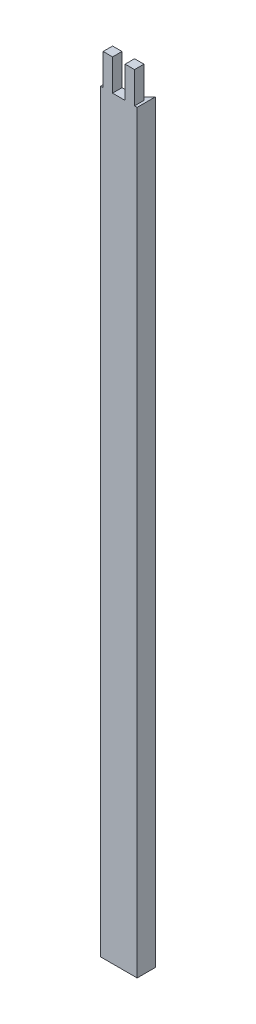
ISO-10303-21;
HEADER;
FILE_DESCRIPTION(('STEP AP214'),'2;1');
FILE_NAME('part.step','',(''),(''),'','','');
FILE_SCHEMA(('AUTOMOTIVE_DESIGN { 1 0 10303 214 1 1 1 1 }'));
ENDSEC;
DATA;
#1=APPLICATION_CONTEXT('core data for automotive mechanical design processes');
#2=APPLICATION_PROTOCOL_DEFINITION('international standard','automotive_design',2000,#1);
#3=PRODUCT_CONTEXT('',#1,'mechanical');
#4=PRODUCT('Part','Part','',(#3));
#5=PRODUCT_RELATED_PRODUCT_CATEGORY('part','',(#4));
#6=PRODUCT_DEFINITION_FORMATION('','',#4);
#7=PRODUCT_DEFINITION_CONTEXT('part definition',#1,'design');
#8=PRODUCT_DEFINITION('design','',#6,#7);
#9=PRODUCT_DEFINITION_SHAPE('','',#8);
#10=(LENGTH_UNIT() NAMED_UNIT(*) SI_UNIT(.MILLI.,.METRE.));
#11=(NAMED_UNIT(*) PLANE_ANGLE_UNIT() SI_UNIT($,.RADIAN.));
#12=(NAMED_UNIT(*) SI_UNIT($,.STERADIAN.) SOLID_ANGLE_UNIT());
#13=UNCERTAINTY_MEASURE_WITH_UNIT(LENGTH_MEASURE(1.E-05),#10,'distance_accuracy_value','');
#14=(GEOMETRIC_REPRESENTATION_CONTEXT(3) GLOBAL_UNCERTAINTY_ASSIGNED_CONTEXT((#13)) GLOBAL_UNIT_ASSIGNED_CONTEXT((#10,
#11,#12)) REPRESENTATION_CONTEXT('',''));
#15=CARTESIAN_POINT('',(0.,0.,0.));
#16=DIRECTION('',(0.,0.,1.));
#17=DIRECTION('',(1.,0.,0.));
#18=AXIS2_PLACEMENT_3D('',#15,#16,#17);
#19=CARTESIAN_POINT('',(0.,0.,3.));
#20=DIRECTION('',(0.,-1.,0.));
#21=DIRECTION('',(1.,0.,0.));
#22=AXIS2_PLACEMENT_3D('',#19,#20,#21);
#23=PLANE('',#22);
#24=DIRECTION('',(0.,0.,-1.));
#25=VECTOR('',#24,1.);
#26=CARTESIAN_POINT('',(2.00000000000002,0.,3.));
#27=LINE('',#26,#25);
#28=CARTESIAN_POINT('',(2.00000000000002,0.,3.));
#29=VERTEX_POINT('',#28);
#30=CARTESIAN_POINT('',(2.00000000000002,0.,0.));
#31=VERTEX_POINT('',#30);
#32=EDGE_CURVE('E169',#29,#31,#27,.T.);
#33=ORIENTED_EDGE('',*,*,#32,.F.);
#34=DIRECTION('',(-1.,0.,0.));
#35=VECTOR('',#34,1.);
#36=CARTESIAN_POINT('',(0.,0.,3.));
#37=LINE('',#36,#35);
#38=CARTESIAN_POINT('',(2.82842712474618,0.,3.));
#39=VERTEX_POINT('',#38);
#40=EDGE_CURVE('E261',#39,#29,#37,.T.);
#41=ORIENTED_EDGE('',*,*,#40,.F.);
#42=DIRECTION('',(0.,0.,1.));
#43=VECTOR('',#42,1.);
#44=CARTESIAN_POINT('',(2.82842712474619,0.,-2.82842712474619));
#45=LINE('',#44,#43);
#46=CARTESIAN_POINT('',(2.82842712474619,0.,-2.82842712474619));
#47=VERTEX_POINT('',#46);
#48=EDGE_CURVE('E242',#47,#39,#45,.T.);
#49=ORIENTED_EDGE('',*,*,#48,.F.);
#50=DIRECTION('',(0.707106781186546,0.,-0.707106781186549));
#51=VECTOR('',#50,1.);
#52=CARTESIAN_POINT('',(0.,0.,0.));
#53=LINE('',#52,#51);
#54=CARTESIAN_POINT('',(0.,0.,0.));
#55=VERTEX_POINT('',#54);
#56=EDGE_CURVE('E238',#55,#47,#53,.T.);
#57=ORIENTED_EDGE('',*,*,#56,.F.);
#58=DIRECTION('',(-1.,0.,0.));
#59=VECTOR('',#58,1.);
#60=CARTESIAN_POINT('',(2.00000000000002,0.,0.));
#61=LINE('',#60,#59);
#62=EDGE_CURVE('E57',#31,#55,#61,.T.);
#63=ORIENTED_EDGE('',*,*,#62,.F.);
#64=EDGE_LOOP('',(#33,#41,#49,#57,#63));
#65=FACE_BOUND('',#64,.T.);
#66=ADVANCED_FACE('F39',(#65),#23,.F.);
#67=DIRECTION('',(0.,0.,1.));
#68=VECTOR('',#67,1.);
#69=CARTESIAN_POINT('',(-0.999999999999984,0.,3.));
#70=LINE('',#69,#68);
#71=CARTESIAN_POINT('',(-0.999999999999984,0.,0.));
#72=VERTEX_POINT('',#71);
#73=CARTESIAN_POINT('',(-0.999999999999984,0.,3.));
#74=VERTEX_POINT('',#73);
#75=EDGE_CURVE('E166',#72,#74,#70,.T.);
#76=ORIENTED_EDGE('',*,*,#75,.F.);
#77=DIRECTION('',(-1.,0.,0.));
#78=VECTOR('',#77,1.);
#79=CARTESIAN_POINT('',(0.,0.,0.));
#80=LINE('',#79,#78);
#81=CARTESIAN_POINT('',(-4.99999999999998,0.,0.));
#82=VERTEX_POINT('',#81);
#83=EDGE_CURVE('E270',#72,#82,#80,.T.);
#84=ORIENTED_EDGE('',*,*,#83,.T.);
#85=DIRECTION('',(0.,0.,-1.));
#86=VECTOR('',#85,1.);
#87=CARTESIAN_POINT('',(-4.99999999999998,0.,3.));
#88=LINE('',#87,#86);
#89=CARTESIAN_POINT('',(-4.99999999999998,0.,3.));
#90=VERTEX_POINT('',#89);
#91=EDGE_CURVE('E176',#90,#82,#88,.T.);
#92=ORIENTED_EDGE('',*,*,#91,.F.);
#93=EDGE_CURVE('E65',#74,#90,#37,.T.);
#94=ORIENTED_EDGE('',*,*,#93,.F.);
#95=EDGE_LOOP('',(#76,#84,#92,#94));
#96=FACE_BOUND('',#95,.T.);
#97=ADVANCED_FACE('F291',(#96),#23,.F.);
#98=DIRECTION('',(0.,0.,1.));
#99=VECTOR('',#98,1.);
#100=CARTESIAN_POINT('',(-7.99999999999999,0.,3.));
#101=LINE('',#100,#99);
#102=CARTESIAN_POINT('',(-7.99999999999998,0.,0.));
#103=VERTEX_POINT('',#102);
#104=CARTESIAN_POINT('',(-7.99999999999999,0.,3.));
#105=VERTEX_POINT('',#104);
#106=EDGE_CURVE('E171',#103,#105,#101,.T.);
#107=ORIENTED_EDGE('',*,*,#106,.F.);
#108=DIRECTION('',(-1.,0.,0.));
#109=VECTOR('',#108,1.);
#110=CARTESIAN_POINT('',(-7.99999999999998,0.,0.));
#111=LINE('',#110,#109);
#112=CARTESIAN_POINT('',(-5.99999999999997,0.,0.));
#113=VERTEX_POINT('',#112);
#114=EDGE_CURVE('E11',#113,#103,#111,.T.);
#115=ORIENTED_EDGE('',*,*,#114,.F.);
#116=DIRECTION('',(0.707106781186546,0.,0.707106781186549));
#117=VECTOR('',#116,1.);
#118=CARTESIAN_POINT('',(-5.99999999999997,0.,0.));
#119=LINE('',#118,#117);
#120=CARTESIAN_POINT('',(-8.82842712474615,0.,-2.8284271247462));
#121=VERTEX_POINT('',#120);
#122=EDGE_CURVE('E219',#121,#113,#119,.T.);
#123=ORIENTED_EDGE('',*,*,#122,.F.);
#124=DIRECTION('',(0.,0.,-1.));
#125=VECTOR('',#124,1.);
#126=CARTESIAN_POINT('',(-8.82842712474615,0.,-2.8284271247462));
#127=LINE('',#126,#125);
#128=CARTESIAN_POINT('',(-8.82842712474615,0.,3.));
#129=VERTEX_POINT('',#128);
#130=EDGE_CURVE('E215',#129,#121,#127,.T.);
#131=ORIENTED_EDGE('',*,*,#130,.F.);
#132=EDGE_CURVE('E265',#105,#129,#37,.T.);
#133=ORIENTED_EDGE('',*,*,#132,.F.);
#134=EDGE_LOOP('',(#107,#115,#123,#131,#133));
#135=FACE_BOUND('',#134,.T.);
#136=ADVANCED_FACE('F41',(#135),#23,.F.);
#137=CARTESIAN_POINT('',(0.,-240.,3.));
#138=DIRECTION('',(0.,1.,0.));
#139=DIRECTION('',(0.,0.,1.));
#140=AXIS2_PLACEMENT_3D('',#137,#138,#139);
#141=PLANE('',#140);
#142=DIRECTION('',(1.,0.,0.));
#143=VECTOR('',#142,1.);
#144=CARTESIAN_POINT('',(0.,-240.,0.));
#145=LINE('',#144,#143);
#146=CARTESIAN_POINT('',(-5.99999999999997,-240.,0.));
#147=VERTEX_POINT('',#146);
#148=CARTESIAN_POINT('',(0.,-240.,0.));
#149=VERTEX_POINT('',#148);
#150=EDGE_CURVE('E43',#147,#149,#145,.T.);
#151=ORIENTED_EDGE('',*,*,#150,.T.);
#152=DIRECTION('',(0.707106781186546,0.,-0.707106781186549));
#153=VECTOR('',#152,1.);
#154=CARTESIAN_POINT('',(0.,-240.,0.));
#155=LINE('',#154,#153);
#156=CARTESIAN_POINT('',(2.82842712474619,-240.,-2.82842712474619));
#157=VERTEX_POINT('',#156);
#158=EDGE_CURVE('E235',#149,#157,#155,.T.);
#159=ORIENTED_EDGE('',*,*,#158,.T.);
#160=DIRECTION('',(0.,0.,1.));
#161=VECTOR('',#160,1.);
#162=CARTESIAN_POINT('',(2.82842712474619,-240.,-2.82842712474619));
#163=LINE('',#162,#161);
#164=CARTESIAN_POINT('',(2.82842712474618,-240.,3.));
#165=VERTEX_POINT('',#164);
#166=EDGE_CURVE('E243',#157,#165,#163,.T.);
#167=ORIENTED_EDGE('',*,*,#166,.T.);
#168=DIRECTION('',(1.,0.,0.));
#169=VECTOR('',#168,1.);
#170=CARTESIAN_POINT('',(0.,-240.,3.));
#171=LINE('',#170,#169);
#172=CARTESIAN_POINT('',(-8.82842712474615,-240.,3.));
#173=VERTEX_POINT('',#172);
#174=EDGE_CURVE('E49',#173,#165,#171,.T.);
#175=ORIENTED_EDGE('',*,*,#174,.F.);
#176=DIRECTION('',(0.,0.,-1.));
#177=VECTOR('',#176,1.);
#178=CARTESIAN_POINT('',(-8.82842712474615,-240.,-2.8284271247462));
#179=LINE('',#178,#177);
#180=CARTESIAN_POINT('',(-8.82842712474615,-240.,-2.8284271247462));
#181=VERTEX_POINT('',#180);
#182=EDGE_CURVE('E214',#173,#181,#179,.T.);
#183=ORIENTED_EDGE('',*,*,#182,.T.);
#184=DIRECTION('',(0.707106781186546,0.,0.707106781186549));
#185=VECTOR('',#184,1.);
#186=CARTESIAN_POINT('',(-5.99999999999997,-240.,0.));
#187=LINE('',#186,#185);
#188=EDGE_CURVE('E220',#181,#147,#187,.T.);
#189=ORIENTED_EDGE('',*,*,#188,.T.);
#190=EDGE_LOOP('',(#151,#159,#167,#175,#183,#189));
#191=FACE_BOUND('',#190,.T.);
#192=ADVANCED_FACE('F315',(#191),#141,.F.);
#193=CARTESIAN_POINT('',(0.,0.,3.));
#194=DIRECTION('',(0.,0.,-1.));
#195=DIRECTION('',(-1.,0.,0.));
#196=AXIS2_PLACEMENT_3D('',#193,#194,#195);
#197=PLANE('',#196);
#198=ORIENTED_EDGE('',*,*,#174,.T.);
#199=DIRECTION('',(0.,-1.,0.));
#200=VECTOR('',#199,1.);
#201=CARTESIAN_POINT('',(2.82842712474618,0.,3.));
#202=LINE('',#201,#200);
#203=EDGE_CURVE('E254',#39,#165,#202,.T.);
#204=ORIENTED_EDGE('',*,*,#203,.F.);
#205=ORIENTED_EDGE('',*,*,#40,.T.);
#206=DIRECTION('',(0.,-1.,0.));
#207=VECTOR('',#206,1.);
#208=CARTESIAN_POINT('',(2.00000000000002,10.,3.));
#209=LINE('',#208,#207);
#210=CARTESIAN_POINT('',(2.00000000000002,10.,3.));
#211=VERTEX_POINT('',#210);
#212=EDGE_CURVE('E318',#211,#29,#209,.T.);
#213=ORIENTED_EDGE('',*,*,#212,.F.);
#214=DIRECTION('',(1.,0.,0.));
#215=VECTOR('',#214,1.);
#216=CARTESIAN_POINT('',(2.00000000000002,10.,3.));
#217=LINE('',#216,#215);
#218=CARTESIAN_POINT('',(-0.999999999999986,10.,3.));
#219=VERTEX_POINT('',#218);
#220=EDGE_CURVE('E161',#219,#211,#217,.T.);
#221=ORIENTED_EDGE('',*,*,#220,.F.);
#222=DIRECTION('',(0.,-1.,0.));
#223=VECTOR('',#222,1.);
#224=CARTESIAN_POINT('',(-0.999999999999986,10.,3.));
#225=LINE('',#224,#223);
#226=EDGE_CURVE('E178',#219,#74,#225,.T.);
#227=ORIENTED_EDGE('',*,*,#226,.T.);
#228=ORIENTED_EDGE('',*,*,#93,.T.);
#229=DIRECTION('',(0.,-1.,0.));
#230=VECTOR('',#229,1.);
#231=CARTESIAN_POINT('',(-4.99999999999999,10.,3.));
#232=LINE('',#231,#230);
#233=CARTESIAN_POINT('',(-4.99999999999999,10.,3.));
#234=VERTEX_POINT('',#233);
#235=EDGE_CURVE('E206',#234,#90,#232,.T.);
#236=ORIENTED_EDGE('',*,*,#235,.F.);
#237=DIRECTION('',(1.,0.,0.));
#238=VECTOR('',#237,1.);
#239=CARTESIAN_POINT('',(-7.99999999999999,10.,3.));
#240=LINE('',#239,#238);
#241=CARTESIAN_POINT('',(-7.99999999999999,10.,3.));
#242=VERTEX_POINT('',#241);
#243=EDGE_CURVE('E186',#242,#234,#240,.T.);
#244=ORIENTED_EDGE('',*,*,#243,.F.);
#245=DIRECTION('',(0.,-1.,0.));
#246=VECTOR('',#245,1.);
#247=CARTESIAN_POINT('',(-7.99999999999999,10.,3.));
#248=LINE('',#247,#246);
#249=EDGE_CURVE('E210',#242,#105,#248,.T.);
#250=ORIENTED_EDGE('',*,*,#249,.T.);
#251=ORIENTED_EDGE('',*,*,#132,.T.);
#252=DIRECTION('',(0.,-1.,0.));
#253=VECTOR('',#252,1.);
#254=CARTESIAN_POINT('',(-8.82842712474615,0.,3.));
#255=LINE('',#254,#253);
#256=EDGE_CURVE('E231',#129,#173,#255,.T.);
#257=ORIENTED_EDGE('',*,*,#256,.T.);
#258=EDGE_LOOP('',(#198,#204,#205,#213,#221,#227,#228,#236,#244,#250,#251,#257));
#259=FACE_BOUND('',#258,.T.);
#260=ADVANCED_FACE('F288',(#259),#197,.F.);
#261=CARTESIAN_POINT('',(0.,0.,0.));
#262=DIRECTION('',(0.,0.,-1.));
#263=DIRECTION('',(-1.,0.,0.));
#264=AXIS2_PLACEMENT_3D('',#261,#262,#263);
#265=PLANE('',#264);
#266=DIRECTION('',(0.,1.,0.));
#267=VECTOR('',#266,1.);
#268=CARTESIAN_POINT('',(0.,0.,0.));
#269=LINE('',#268,#267);
#270=EDGE_CURVE('E258',#149,#55,#269,.T.);
#271=ORIENTED_EDGE('',*,*,#270,.F.);
#272=ORIENTED_EDGE('',*,*,#150,.F.);
#273=DIRECTION('',(0.,-1.,0.));
#274=VECTOR('',#273,1.);
#275=CARTESIAN_POINT('',(-6.,0.,0.));
#276=LINE('',#275,#274);
#277=EDGE_CURVE('E272',#113,#147,#276,.T.);
#278=ORIENTED_EDGE('',*,*,#277,.F.);
#279=ORIENTED_EDGE('',*,*,#114,.T.);
#280=DIRECTION('',(0.,-1.,0.));
#281=VECTOR('',#280,1.);
#282=CARTESIAN_POINT('',(-7.99999999999999,10.,0.));
#283=LINE('',#282,#281);
#284=CARTESIAN_POINT('',(-7.99999999999999,10.,0.));
#285=VERTEX_POINT('',#284);
#286=EDGE_CURVE('E194',#285,#103,#283,.T.);
#287=ORIENTED_EDGE('',*,*,#286,.F.);
#288=DIRECTION('',(-1.,0.,0.));
#289=VECTOR('',#288,1.);
#290=CARTESIAN_POINT('',(-7.99999999999999,10.,0.));
#291=LINE('',#290,#289);
#292=CARTESIAN_POINT('',(-4.99999999999999,10.,0.));
#293=VERTEX_POINT('',#292);
#294=EDGE_CURVE('E192',#293,#285,#291,.T.);
#295=ORIENTED_EDGE('',*,*,#294,.F.);
#296=DIRECTION('',(0.,-1.,0.));
#297=VECTOR('',#296,1.);
#298=CARTESIAN_POINT('',(-4.99999999999999,10.,0.));
#299=LINE('',#298,#297);
#300=EDGE_CURVE('E202',#293,#82,#299,.T.);
#301=ORIENTED_EDGE('',*,*,#300,.T.);
#302=ORIENTED_EDGE('',*,*,#83,.F.);
#303=DIRECTION('',(0.,-1.,0.));
#304=VECTOR('',#303,1.);
#305=CARTESIAN_POINT('',(-0.999999999999986,10.,0.));
#306=LINE('',#305,#304);
#307=CARTESIAN_POINT('',(-0.999999999999986,10.,0.));
#308=VERTEX_POINT('',#307);
#309=EDGE_CURVE('E151',#308,#72,#306,.T.);
#310=ORIENTED_EDGE('',*,*,#309,.F.);
#311=DIRECTION('',(-1.,0.,0.));
#312=VECTOR('',#311,1.);
#313=CARTESIAN_POINT('',(2.00000000000001,10.,0.));
#314=LINE('',#313,#312);
#315=CARTESIAN_POINT('',(2.00000000000001,10.,0.));
#316=VERTEX_POINT('',#315);
#317=EDGE_CURVE('E144',#316,#308,#314,.T.);
#318=ORIENTED_EDGE('',*,*,#317,.F.);
#319=DIRECTION('',(0.,-1.,0.));
#320=VECTOR('',#319,1.);
#321=CARTESIAN_POINT('',(2.00000000000001,10.,0.));
#322=LINE('',#321,#320);
#323=EDGE_CURVE('E148',#316,#31,#322,.T.);
#324=ORIENTED_EDGE('',*,*,#323,.T.);
#325=ORIENTED_EDGE('',*,*,#62,.T.);
#326=EDGE_LOOP('',(#271,#272,#278,#279,#287,#295,#301,#302,#310,#318,#324,#325));
#327=FACE_BOUND('',#326,.T.);
#328=ADVANCED_FACE('F146',(#327),#265,.T.);
#329=CARTESIAN_POINT('',(2.82842712474619,0.,-2.82842712474619));
#330=DIRECTION('',(1.,0.,0.));
#331=DIRECTION('',(0.,0.,-1.));
#332=AXIS2_PLACEMENT_3D('',#329,#330,#331);
#333=PLANE('',#332);
#334=ORIENTED_EDGE('',*,*,#166,.F.);
#335=DIRECTION('',(0.,-1.,0.));
#336=VECTOR('',#335,1.);
#337=CARTESIAN_POINT('',(2.82842712474619,0.,-2.82842712474619));
#338=LINE('',#337,#336);
#339=EDGE_CURVE('E247',#47,#157,#338,.T.);
#340=ORIENTED_EDGE('',*,*,#339,.F.);
#341=ORIENTED_EDGE('',*,*,#48,.T.);
#342=ORIENTED_EDGE('',*,*,#203,.T.);
#343=EDGE_LOOP('',(#334,#340,#341,#342));
#344=FACE_BOUND('',#343,.T.);
#345=ADVANCED_FACE('F313',(#344),#333,.T.);
#346=CARTESIAN_POINT('',(0.,0.,0.));
#347=DIRECTION('',(-0.707106781186549,0.,-0.707106781186546));
#348=DIRECTION('',(-0.707106781186546,0.,0.707106781186549));
#349=AXIS2_PLACEMENT_3D('',#346,#347,#348);
#350=PLANE('',#349);
#351=ORIENTED_EDGE('',*,*,#158,.F.);
#352=ORIENTED_EDGE('',*,*,#270,.T.);
#353=ORIENTED_EDGE('',*,*,#56,.T.);
#354=ORIENTED_EDGE('',*,*,#339,.T.);
#355=EDGE_LOOP('',(#351,#352,#353,#354));
#356=FACE_BOUND('',#355,.T.);
#357=ADVANCED_FACE('F317',(#356),#350,.T.);
#358=CARTESIAN_POINT('',(-8.82842712474615,0.,-2.8284271247462));
#359=DIRECTION('',(-1.,0.,0.));
#360=DIRECTION('',(0.,0.,1.));
#361=AXIS2_PLACEMENT_3D('',#358,#359,#360);
#362=PLANE('',#361);
#363=ORIENTED_EDGE('',*,*,#182,.F.);
#364=ORIENTED_EDGE('',*,*,#256,.F.);
#365=ORIENTED_EDGE('',*,*,#130,.T.);
#366=DIRECTION('',(0.,-1.,0.));
#367=VECTOR('',#366,1.);
#368=CARTESIAN_POINT('',(-8.82842712474615,0.,-2.8284271247462));
#369=LINE('',#368,#367);
#370=EDGE_CURVE('E224',#121,#181,#369,.T.);
#371=ORIENTED_EDGE('',*,*,#370,.T.);
#372=EDGE_LOOP('',(#363,#364,#365,#371));
#373=FACE_BOUND('',#372,.T.);
#374=ADVANCED_FACE('F309',(#373),#362,.T.);
#375=CARTESIAN_POINT('',(-5.99999999999997,0.,0.));
#376=DIRECTION('',(0.707106781186549,0.,-0.707106781186546));
#377=DIRECTION('',(-0.707106781186546,0.,-0.707106781186549));
#378=AXIS2_PLACEMENT_3D('',#375,#376,#377);
#379=PLANE('',#378);
#380=ORIENTED_EDGE('',*,*,#188,.F.);
#381=ORIENTED_EDGE('',*,*,#370,.F.);
#382=ORIENTED_EDGE('',*,*,#122,.T.);
#383=ORIENTED_EDGE('',*,*,#277,.T.);
#384=EDGE_LOOP('',(#380,#381,#382,#383));
#385=FACE_BOUND('',#384,.T.);
#386=ADVANCED_FACE('F306',(#385),#379,.T.);
#387=CARTESIAN_POINT('',(-7.99999999999999,10.,3.));
#388=DIRECTION('',(1.,0.,0.));
#389=DIRECTION('',(0.,0.,-1.));
#390=AXIS2_PLACEMENT_3D('',#387,#388,#389);
#391=PLANE('',#390);
#392=ORIENTED_EDGE('',*,*,#106,.T.);
#393=ORIENTED_EDGE('',*,*,#249,.F.);
#394=DIRECTION('',(0.,0.,1.));
#395=VECTOR('',#394,1.);
#396=CARTESIAN_POINT('',(-7.99999999999999,10.,3.));
#397=LINE('',#396,#395);
#398=EDGE_CURVE('E182',#285,#242,#397,.T.);
#399=ORIENTED_EDGE('',*,*,#398,.F.);
#400=ORIENTED_EDGE('',*,*,#286,.T.);
#401=EDGE_LOOP('',(#392,#393,#399,#400));
#402=FACE_BOUND('',#401,.T.);
#403=ADVANCED_FACE('F302',(#402),#391,.F.);
#404=CARTESIAN_POINT('',(-4.99999999999999,10.,3.));
#405=DIRECTION('',(-1.,0.,0.));
#406=DIRECTION('',(0.,-1.,0.));
#407=AXIS2_PLACEMENT_3D('',#404,#405,#406);
#408=PLANE('',#407);
#409=ORIENTED_EDGE('',*,*,#91,.T.);
#410=ORIENTED_EDGE('',*,*,#300,.F.);
#411=DIRECTION('',(0.,0.,-1.));
#412=VECTOR('',#411,1.);
#413=CARTESIAN_POINT('',(-4.99999999999999,10.,3.));
#414=LINE('',#413,#412);
#415=EDGE_CURVE('E189',#234,#293,#414,.T.);
#416=ORIENTED_EDGE('',*,*,#415,.F.);
#417=ORIENTED_EDGE('',*,*,#235,.T.);
#418=EDGE_LOOP('',(#409,#410,#416,#417));
#419=FACE_BOUND('',#418,.T.);
#420=ADVANCED_FACE('F294',(#419),#408,.F.);
#421=CARTESIAN_POINT('',(0.,10.,0.));
#422=DIRECTION('',(0.,-1.,0.));
#423=DIRECTION('',(1.,0.,0.));
#424=AXIS2_PLACEMENT_3D('',#421,#422,#423);
#425=PLANE('',#424);
#426=ORIENTED_EDGE('',*,*,#398,.T.);
#427=ORIENTED_EDGE('',*,*,#243,.T.);
#428=ORIENTED_EDGE('',*,*,#415,.T.);
#429=ORIENTED_EDGE('',*,*,#294,.T.);
#430=EDGE_LOOP('',(#426,#427,#428,#429));
#431=FACE_BOUND('',#430,.T.);
#432=ADVANCED_FACE('F297',(#431),#425,.F.);
#433=CARTESIAN_POINT('',(2.00000000000002,10.,3.));
#434=DIRECTION('',(-1.,0.,0.));
#435=DIRECTION('',(0.,0.,1.));
#436=AXIS2_PLACEMENT_3D('',#433,#434,#435);
#437=PLANE('',#436);
#438=ORIENTED_EDGE('',*,*,#32,.T.);
#439=ORIENTED_EDGE('',*,*,#323,.F.);
#440=DIRECTION('',(0.,0.,-1.));
#441=VECTOR('',#440,1.);
#442=CARTESIAN_POINT('',(2.00000000000002,10.,3.));
#443=LINE('',#442,#441);
#444=EDGE_CURVE('E156',#211,#316,#443,.T.);
#445=ORIENTED_EDGE('',*,*,#444,.F.);
#446=ORIENTED_EDGE('',*,*,#212,.T.);
#447=EDGE_LOOP('',(#438,#439,#445,#446));
#448=FACE_BOUND('',#447,.T.);
#449=ADVANCED_FACE('F168',(#448),#437,.F.);
#450=CARTESIAN_POINT('',(-0.999999999999986,10.,3.));
#451=DIRECTION('',(1.,0.,0.));
#452=DIRECTION('',(0.,1.,0.));
#453=AXIS2_PLACEMENT_3D('',#450,#451,#452);
#454=PLANE('',#453);
#455=ORIENTED_EDGE('',*,*,#75,.T.);
#456=ORIENTED_EDGE('',*,*,#226,.F.);
#457=DIRECTION('',(0.,0.,1.));
#458=VECTOR('',#457,1.);
#459=CARTESIAN_POINT('',(-0.999999999999986,10.,3.));
#460=LINE('',#459,#458);
#461=EDGE_CURVE('E155',#308,#219,#460,.T.);
#462=ORIENTED_EDGE('',*,*,#461,.F.);
#463=ORIENTED_EDGE('',*,*,#309,.T.);
#464=EDGE_LOOP('',(#455,#456,#462,#463));
#465=FACE_BOUND('',#464,.T.);
#466=ADVANCED_FACE('F333',(#465),#454,.F.);
#467=CARTESIAN_POINT('',(0.,10.,0.));
#468=DIRECTION('',(0.,1.,0.));
#469=DIRECTION('',(-1.,0.,0.));
#470=AXIS2_PLACEMENT_3D('',#467,#468,#469);
#471=PLANE('',#470);
#472=ORIENTED_EDGE('',*,*,#444,.T.);
#473=ORIENTED_EDGE('',*,*,#317,.T.);
#474=ORIENTED_EDGE('',*,*,#461,.T.);
#475=ORIENTED_EDGE('',*,*,#220,.T.);
#476=EDGE_LOOP('',(#472,#473,#474,#475));
#477=FACE_BOUND('',#476,.T.);
#478=ADVANCED_FACE('F159',(#477),#471,.T.);
#479=CLOSED_SHELL('',(#66,#97,#136,#192,#260,#328,#345,#357,#374,#386,#403,#420,#432,#449,#466,#478));
#480=MANIFOLD_SOLID_BREP('B2',#479);
#481=ADVANCED_BREP_SHAPE_REPRESENTATION('',(#18,#480),#14);
#482=SHAPE_DEFINITION_REPRESENTATION(#9,#481);
ENDSEC;
END-ISO-10303-21;
